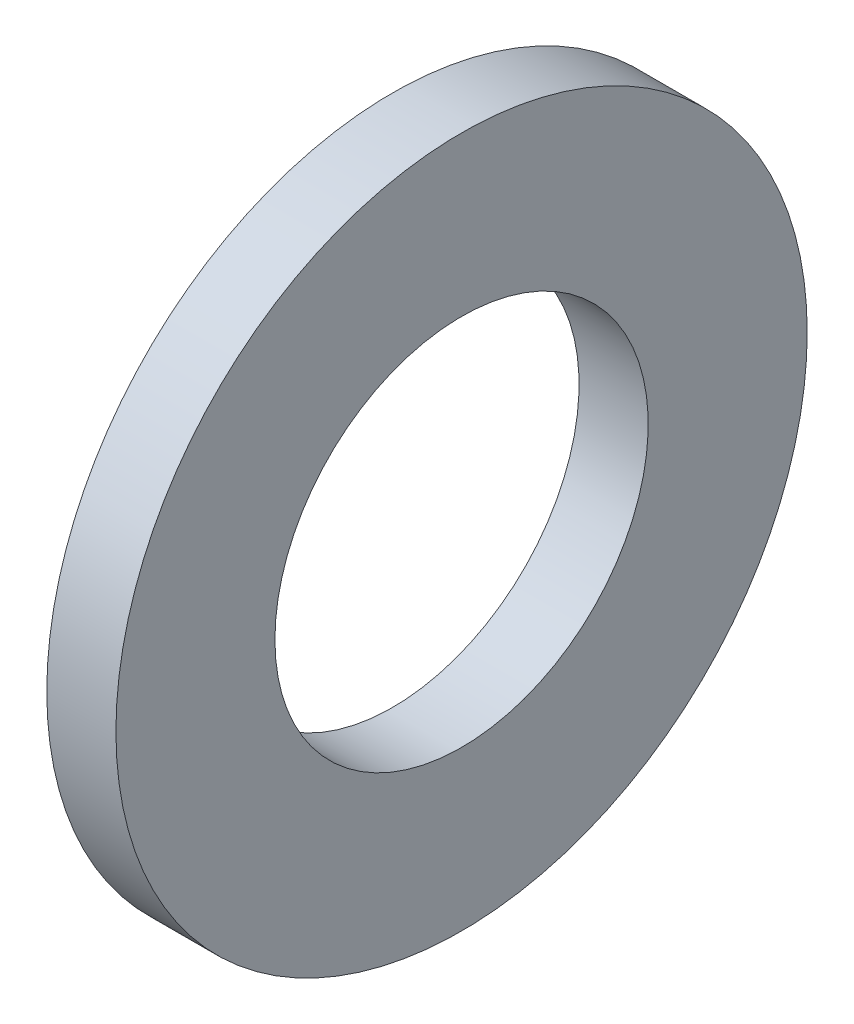
ISO-10303-21;
HEADER;
FILE_DESCRIPTION(('STEP AP214'),'2;1');
FILE_NAME('part.step','',(''),(''),'','','');
FILE_SCHEMA(('AUTOMOTIVE_DESIGN { 1 0 10303 214 1 1 1 1 }'));
ENDSEC;
DATA;
#1=APPLICATION_CONTEXT('core data for automotive mechanical design processes');
#2=APPLICATION_PROTOCOL_DEFINITION('international standard','automotive_design',2000,#1);
#3=PRODUCT_CONTEXT('',#1,'mechanical');
#4=PRODUCT('Part','Part','',(#3));
#5=PRODUCT_RELATED_PRODUCT_CATEGORY('part','',(#4));
#6=PRODUCT_DEFINITION_FORMATION('','',#4);
#7=PRODUCT_DEFINITION_CONTEXT('part definition',#1,'design');
#8=PRODUCT_DEFINITION('design','',#6,#7);
#9=PRODUCT_DEFINITION_SHAPE('','',#8);
#10=(LENGTH_UNIT() NAMED_UNIT(*) SI_UNIT(.MILLI.,.METRE.));
#11=(NAMED_UNIT(*) PLANE_ANGLE_UNIT() SI_UNIT($,.RADIAN.));
#12=(NAMED_UNIT(*) SI_UNIT($,.STERADIAN.) SOLID_ANGLE_UNIT());
#13=UNCERTAINTY_MEASURE_WITH_UNIT(LENGTH_MEASURE(1.E-05),#10,'distance_accuracy_value','');
#14=(GEOMETRIC_REPRESENTATION_CONTEXT(3) GLOBAL_UNCERTAINTY_ASSIGNED_CONTEXT((#13)) GLOBAL_UNIT_ASSIGNED_CONTEXT((#10,
#11,#12)) REPRESENTATION_CONTEXT('',''));
#15=CARTESIAN_POINT('',(0.,0.,0.));
#16=DIRECTION('',(0.,0.,1.));
#17=DIRECTION('',(1.,0.,0.));
#18=AXIS2_PLACEMENT_3D('',#15,#16,#17);
#19=CARTESIAN_POINT('',(-34.9249999999999,0.,0.));
#20=DIRECTION('',(-1.,0.,0.));
#21=DIRECTION('',(0.,0.,1.));
#22=AXIS2_PLACEMENT_3D('',#19,#20,#21);
#23=CYLINDRICAL_SURFACE('',#22,1.35);
#24=CARTESIAN_POINT('',(0.,0.,0.));
#25=DIRECTION('',(-1.,0.,0.));
#26=DIRECTION('',(0.,0.,1.));
#27=AXIS2_PLACEMENT_3D('',#24,#25,#26);
#28=CIRCLE('',#27,1.35);
#29=CARTESIAN_POINT('',(0.,0.,1.35));
#30=VERTEX_POINT('',#29);
#31=EDGE_CURVE('E10',#30,#30,#28,.T.);
#32=ORIENTED_EDGE('',*,*,#31,.F.);
#33=EDGE_LOOP('',(#32));
#34=FACE_BOUND('',#33,.T.);
#35=CARTESIAN_POINT('',(-0.5,0.,0.));
#36=DIRECTION('',(-1.,0.,0.));
#37=DIRECTION('',(0.,0.,1.));
#38=AXIS2_PLACEMENT_3D('',#35,#36,#37);
#39=CIRCLE('',#38,1.35);
#40=CARTESIAN_POINT('',(-0.5,0.,1.35));
#41=VERTEX_POINT('',#40);
#42=EDGE_CURVE('E48',#41,#41,#39,.T.);
#43=ORIENTED_EDGE('',*,*,#42,.T.);
#44=EDGE_LOOP('',(#43));
#45=FACE_BOUND('',#44,.T.);
#46=ADVANCED_FACE('F34',(#34,#45),#23,.F.);
#47=CARTESIAN_POINT('',(0.,1.35,0.));
#48=DIRECTION('',(-1.,0.,0.));
#49=DIRECTION('',(0.,0.,1.));
#50=AXIS2_PLACEMENT_3D('',#47,#48,#49);
#51=PLANE('',#50);
#52=CARTESIAN_POINT('',(0.,0.,0.));
#53=DIRECTION('',(-1.,0.,0.));
#54=DIRECTION('',(0.,0.,1.));
#55=AXIS2_PLACEMENT_3D('',#52,#53,#54);
#56=CIRCLE('',#55,2.5);
#57=CARTESIAN_POINT('',(0.,0.,2.5));
#58=VERTEX_POINT('',#57);
#59=EDGE_CURVE('E40',#58,#58,#56,.T.);
#60=ORIENTED_EDGE('',*,*,#59,.F.);
#61=EDGE_LOOP('',(#60));
#62=FACE_BOUND('',#61,.T.);
#63=ORIENTED_EDGE('',*,*,#31,.T.);
#64=EDGE_LOOP('',(#63));
#65=FACE_BOUND('',#64,.T.);
#66=ADVANCED_FACE('F63',(#62,#65),#51,.F.);
#67=CARTESIAN_POINT('',(-34.9249999999999,0.,0.));
#68=DIRECTION('',(-1.,0.,0.));
#69=DIRECTION('',(0.,0.,1.));
#70=AXIS2_PLACEMENT_3D('',#67,#68,#69);
#71=CYLINDRICAL_SURFACE('',#70,2.5);
#72=CARTESIAN_POINT('',(-0.5,0.,0.));
#73=DIRECTION('',(-1.,0.,0.));
#74=DIRECTION('',(0.,0.,1.));
#75=AXIS2_PLACEMENT_3D('',#72,#73,#74);
#76=CIRCLE('',#75,2.5);
#77=CARTESIAN_POINT('',(-0.5,0.,2.5));
#78=VERTEX_POINT('',#77);
#79=EDGE_CURVE('E44',#78,#78,#76,.T.);
#80=ORIENTED_EDGE('',*,*,#79,.F.);
#81=EDGE_LOOP('',(#80));
#82=FACE_BOUND('',#81,.T.);
#83=ORIENTED_EDGE('',*,*,#59,.T.);
#84=EDGE_LOOP('',(#83));
#85=FACE_BOUND('',#84,.T.);
#86=ADVANCED_FACE('F58',(#82,#85),#71,.T.);
#87=CARTESIAN_POINT('',(-0.5,2.5,0.));
#88=DIRECTION('',(1.,0.,0.));
#89=DIRECTION('',(0.,0.,-1.));
#90=AXIS2_PLACEMENT_3D('',#87,#88,#89);
#91=PLANE('',#90);
#92=ORIENTED_EDGE('',*,*,#42,.F.);
#93=EDGE_LOOP('',(#92));
#94=FACE_BOUND('',#93,.T.);
#95=ORIENTED_EDGE('',*,*,#79,.T.);
#96=EDGE_LOOP('',(#95));
#97=FACE_BOUND('',#96,.T.);
#98=ADVANCED_FACE('F55',(#94,#97),#91,.F.);
#99=CLOSED_SHELL('',(#46,#66,#86,#98));
#100=MANIFOLD_SOLID_BREP('B2',#99);
#101=ADVANCED_BREP_SHAPE_REPRESENTATION('',(#18,#100),#14);
#102=SHAPE_DEFINITION_REPRESENTATION(#9,#101);
ENDSEC;
END-ISO-10303-21;
